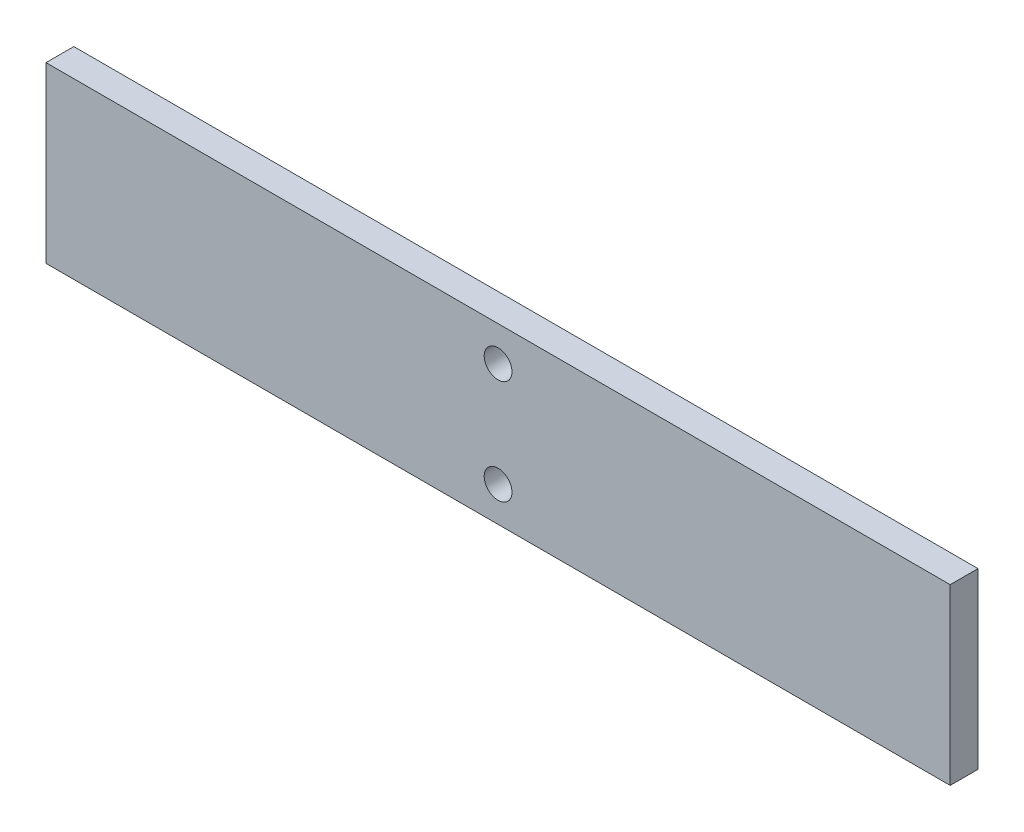
ISO-10303-21;
HEADER;
FILE_DESCRIPTION(('STEP AP214'),'2;1');
FILE_NAME('part.step','',(''),(''),'','','');
FILE_SCHEMA(('AUTOMOTIVE_DESIGN { 1 0 10303 214 1 1 1 1 }'));
ENDSEC;
DATA;
#1=APPLICATION_CONTEXT('core data for automotive mechanical design processes');
#2=APPLICATION_PROTOCOL_DEFINITION('international standard','automotive_design',2000,#1);
#3=PRODUCT_CONTEXT('',#1,'mechanical');
#4=PRODUCT('Part','Part','',(#3));
#5=PRODUCT_RELATED_PRODUCT_CATEGORY('part','',(#4));
#6=PRODUCT_DEFINITION_FORMATION('','',#4);
#7=PRODUCT_DEFINITION_CONTEXT('part definition',#1,'design');
#8=PRODUCT_DEFINITION('design','',#6,#7);
#9=PRODUCT_DEFINITION_SHAPE('','',#8);
#10=(LENGTH_UNIT() NAMED_UNIT(*) SI_UNIT(.MILLI.,.METRE.));
#11=(NAMED_UNIT(*) PLANE_ANGLE_UNIT() SI_UNIT($,.RADIAN.));
#12=(NAMED_UNIT(*) SI_UNIT($,.STERADIAN.) SOLID_ANGLE_UNIT());
#13=UNCERTAINTY_MEASURE_WITH_UNIT(LENGTH_MEASURE(1.E-05),#10,'distance_accuracy_value','');
#14=(GEOMETRIC_REPRESENTATION_CONTEXT(3) GLOBAL_UNCERTAINTY_ASSIGNED_CONTEXT((#13)) GLOBAL_UNIT_ASSIGNED_CONTEXT((#10,
#11,#12)) REPRESENTATION_CONTEXT('',''));
#15=CARTESIAN_POINT('',(0.,0.,0.));
#16=DIRECTION('',(0.,0.,1.));
#17=DIRECTION('',(1.,0.,0.));
#18=AXIS2_PLACEMENT_3D('',#15,#16,#17);
#19=CARTESIAN_POINT('',(0.,10.,1.6));
#20=DIRECTION('',(1.,0.,0.));
#21=DIRECTION('',(0.,1.,0.));
#22=AXIS2_PLACEMENT_3D('',#19,#20,#21);
#23=PLANE('',#22);
#24=DIRECTION('',(0.,-1.,0.));
#25=VECTOR('',#24,1.);
#26=CARTESIAN_POINT('',(0.,10.,0.));
#27=LINE('',#26,#25);
#28=CARTESIAN_POINT('',(0.,10.,0.));
#29=VERTEX_POINT('',#28);
#30=CARTESIAN_POINT('',(0.,0.,0.));
#31=VERTEX_POINT('',#30);
#32=EDGE_CURVE('E105',#29,#31,#27,.T.);
#33=ORIENTED_EDGE('',*,*,#32,.T.);
#34=DIRECTION('',(0.,0.,-1.));
#35=VECTOR('',#34,1.);
#36=CARTESIAN_POINT('',(0.,0.,1.6));
#37=LINE('',#36,#35);
#38=CARTESIAN_POINT('',(0.,0.,1.6));
#39=VERTEX_POINT('',#38);
#40=EDGE_CURVE('E11',#39,#31,#37,.T.);
#41=ORIENTED_EDGE('',*,*,#40,.F.);
#42=DIRECTION('',(0.,-1.,0.));
#43=VECTOR('',#42,1.);
#44=CARTESIAN_POINT('',(0.,10.,1.6));
#45=LINE('',#44,#43);
#46=CARTESIAN_POINT('',(0.,10.,1.6));
#47=VERTEX_POINT('',#46);
#48=EDGE_CURVE('E89',#47,#39,#45,.T.);
#49=ORIENTED_EDGE('',*,*,#48,.F.);
#50=DIRECTION('',(0.,0.,-1.));
#51=VECTOR('',#50,1.);
#52=CARTESIAN_POINT('',(0.,10.,1.6));
#53=LINE('',#52,#51);
#54=EDGE_CURVE('E98',#47,#29,#53,.T.);
#55=ORIENTED_EDGE('',*,*,#54,.T.);
#56=EDGE_LOOP('',(#33,#41,#49,#55));
#57=FACE_BOUND('',#56,.T.);
#58=ADVANCED_FACE('F39',(#57),#23,.F.);
#59=CARTESIAN_POINT('',(0.,0.,1.6));
#60=DIRECTION('',(0.,1.,0.));
#61=DIRECTION('',(0.,0.,1.));
#62=AXIS2_PLACEMENT_3D('',#59,#60,#61);
#63=PLANE('',#62);
#64=DIRECTION('',(1.,0.,0.));
#65=VECTOR('',#64,1.);
#66=CARTESIAN_POINT('',(0.,0.,0.));
#67=LINE('',#66,#65);
#68=CARTESIAN_POINT('',(52.,0.,0.));
#69=VERTEX_POINT('',#68);
#70=EDGE_CURVE('E94',#31,#69,#67,.T.);
#71=ORIENTED_EDGE('',*,*,#70,.T.);
#72=DIRECTION('',(0.,0.,-1.));
#73=VECTOR('',#72,1.);
#74=CARTESIAN_POINT('',(52.,0.,1.6));
#75=LINE('',#74,#73);
#76=CARTESIAN_POINT('',(52.,0.,1.6));
#77=VERTEX_POINT('',#76);
#78=EDGE_CURVE('E50',#77,#69,#75,.T.);
#79=ORIENTED_EDGE('',*,*,#78,.F.);
#80=DIRECTION('',(1.,0.,0.));
#81=VECTOR('',#80,1.);
#82=CARTESIAN_POINT('',(0.,0.,1.6));
#83=LINE('',#82,#81);
#84=EDGE_CURVE('E83',#39,#77,#83,.T.);
#85=ORIENTED_EDGE('',*,*,#84,.F.);
#86=ORIENTED_EDGE('',*,*,#40,.T.);
#87=EDGE_LOOP('',(#71,#79,#85,#86));
#88=FACE_BOUND('',#87,.T.);
#89=ADVANCED_FACE('F91',(#88),#63,.F.);
#90=CARTESIAN_POINT('',(52.,10.,1.6));
#91=DIRECTION('',(-1.,0.,0.));
#92=DIRECTION('',(0.,0.,1.));
#93=AXIS2_PLACEMENT_3D('',#90,#91,#92);
#94=PLANE('',#93);
#95=DIRECTION('',(0.,1.,0.));
#96=VECTOR('',#95,1.);
#97=CARTESIAN_POINT('',(52.,10.,0.));
#98=LINE('',#97,#96);
#99=CARTESIAN_POINT('',(52.,10.,0.));
#100=VERTEX_POINT('',#99);
#101=EDGE_CURVE('E75',#69,#100,#98,.T.);
#102=ORIENTED_EDGE('',*,*,#101,.T.);
#103=DIRECTION('',(0.,0.,-1.));
#104=VECTOR('',#103,1.);
#105=CARTESIAN_POINT('',(52.,10.,1.6));
#106=LINE('',#105,#104);
#107=CARTESIAN_POINT('',(52.,10.,1.6));
#108=VERTEX_POINT('',#107);
#109=EDGE_CURVE('E92',#108,#100,#106,.T.);
#110=ORIENTED_EDGE('',*,*,#109,.F.);
#111=DIRECTION('',(0.,1.,0.));
#112=VECTOR('',#111,1.);
#113=CARTESIAN_POINT('',(52.,10.,1.6));
#114=LINE('',#113,#112);
#115=EDGE_CURVE('E86',#77,#108,#114,.T.);
#116=ORIENTED_EDGE('',*,*,#115,.F.);
#117=ORIENTED_EDGE('',*,*,#78,.T.);
#118=EDGE_LOOP('',(#102,#110,#116,#117));
#119=FACE_BOUND('',#118,.T.);
#120=ADVANCED_FACE('F96',(#119),#94,.F.);
#121=CARTESIAN_POINT('',(0.,10.,1.6));
#122=DIRECTION('',(0.,-1.,0.));
#123=DIRECTION('',(0.,0.,-1.));
#124=AXIS2_PLACEMENT_3D('',#121,#122,#123);
#125=PLANE('',#124);
#126=DIRECTION('',(-1.,0.,0.));
#127=VECTOR('',#126,1.);
#128=CARTESIAN_POINT('',(0.,10.,0.));
#129=LINE('',#128,#127);
#130=EDGE_CURVE('E79',#100,#29,#129,.T.);
#131=ORIENTED_EDGE('',*,*,#130,.T.);
#132=ORIENTED_EDGE('',*,*,#54,.F.);
#133=DIRECTION('',(-1.,0.,0.));
#134=VECTOR('',#133,1.);
#135=CARTESIAN_POINT('',(0.,10.,1.6));
#136=LINE('',#135,#134);
#137=EDGE_CURVE('E54',#108,#47,#136,.T.);
#138=ORIENTED_EDGE('',*,*,#137,.F.);
#139=ORIENTED_EDGE('',*,*,#109,.T.);
#140=EDGE_LOOP('',(#131,#132,#138,#139));
#141=FACE_BOUND('',#140,.T.);
#142=ADVANCED_FACE('F109',(#141),#125,.F.);
#143=CARTESIAN_POINT('',(0.,0.,1.6));
#144=DIRECTION('',(0.,0.,1.));
#145=DIRECTION('',(1.,0.,0.));
#146=AXIS2_PLACEMENT_3D('',#143,#144,#145);
#147=PLANE('',#146);
#148=CARTESIAN_POINT('',(26.,2.,1.6));
#149=DIRECTION('',(0.,0.,1.));
#150=DIRECTION('',(1.,0.,0.));
#151=AXIS2_PLACEMENT_3D('',#148,#149,#150);
#152=CIRCLE('',#151,0.799999999999999);
#153=CARTESIAN_POINT('',(26.8,2.,1.6));
#154=VERTEX_POINT('',#153);
#155=EDGE_CURVE('E104',#154,#154,#152,.T.);
#156=ORIENTED_EDGE('',*,*,#155,.F.);
#157=EDGE_LOOP('',(#156));
#158=FACE_BOUND('',#157,.T.);
#159=CARTESIAN_POINT('',(26.,8.,1.6));
#160=DIRECTION('',(0.,0.,1.));
#161=DIRECTION('',(1.,0.,0.));
#162=AXIS2_PLACEMENT_3D('',#159,#160,#161);
#163=CIRCLE('',#162,0.799999999999999);
#164=CARTESIAN_POINT('',(26.8,8.,1.6));
#165=VERTEX_POINT('',#164);
#166=EDGE_CURVE('E117',#165,#165,#163,.T.);
#167=ORIENTED_EDGE('',*,*,#166,.F.);
#168=EDGE_LOOP('',(#167));
#169=FACE_BOUND('',#168,.T.);
#170=ORIENTED_EDGE('',*,*,#48,.T.);
#171=ORIENTED_EDGE('',*,*,#84,.T.);
#172=ORIENTED_EDGE('',*,*,#115,.T.);
#173=ORIENTED_EDGE('',*,*,#137,.T.);
#174=EDGE_LOOP('',(#170,#171,#172,#173));
#175=FACE_BOUND('',#174,.T.);
#176=ADVANCED_FACE('F88',(#158,#169,#175),#147,.T.);
#177=CARTESIAN_POINT('',(0.,0.,0.));
#178=DIRECTION('',(0.,0.,1.));
#179=DIRECTION('',(1.,0.,0.));
#180=AXIS2_PLACEMENT_3D('',#177,#178,#179);
#181=PLANE('',#180);
#182=CARTESIAN_POINT('',(26.,2.,0.));
#183=DIRECTION('',(0.,0.,1.));
#184=DIRECTION('',(1.,0.,0.));
#185=AXIS2_PLACEMENT_3D('',#182,#183,#184);
#186=CIRCLE('',#185,0.799999999999999);
#187=CARTESIAN_POINT('',(26.8,2.,0.));
#188=VERTEX_POINT('',#187);
#189=EDGE_CURVE('E124',#188,#188,#186,.T.);
#190=ORIENTED_EDGE('',*,*,#189,.T.);
#191=EDGE_LOOP('',(#190));
#192=FACE_BOUND('',#191,.T.);
#193=CARTESIAN_POINT('',(26.,8.,0.));
#194=DIRECTION('',(0.,0.,1.));
#195=DIRECTION('',(1.,0.,0.));
#196=AXIS2_PLACEMENT_3D('',#193,#194,#195);
#197=CIRCLE('',#196,0.799999999999999);
#198=CARTESIAN_POINT('',(26.8,8.,0.));
#199=VERTEX_POINT('',#198);
#200=EDGE_CURVE('E116',#199,#199,#197,.T.);
#201=ORIENTED_EDGE('',*,*,#200,.T.);
#202=EDGE_LOOP('',(#201));
#203=FACE_BOUND('',#202,.T.);
#204=ORIENTED_EDGE('',*,*,#32,.F.);
#205=ORIENTED_EDGE('',*,*,#130,.F.);
#206=ORIENTED_EDGE('',*,*,#101,.F.);
#207=ORIENTED_EDGE('',*,*,#70,.F.);
#208=EDGE_LOOP('',(#204,#205,#206,#207));
#209=FACE_BOUND('',#208,.T.);
#210=ADVANCED_FACE('F114',(#192,#203,#209),#181,.F.);
#211=CARTESIAN_POINT('',(26.,8.,1.6));
#212=DIRECTION('',(0.,0.,-1.));
#213=DIRECTION('',(-1.,0.,0.));
#214=AXIS2_PLACEMENT_3D('',#211,#212,#213);
#215=CYLINDRICAL_SURFACE('',#214,0.799999999999999);
#216=ORIENTED_EDGE('',*,*,#166,.T.);
#217=EDGE_LOOP('',(#216));
#218=FACE_BOUND('',#217,.T.);
#219=ORIENTED_EDGE('',*,*,#200,.F.);
#220=EDGE_LOOP('',(#219));
#221=FACE_BOUND('',#220,.T.);
#222=ADVANCED_FACE('F137',(#218,#221),#215,.F.);
#223=CARTESIAN_POINT('',(26.,2.,1.6));
#224=DIRECTION('',(0.,0.,-1.));
#225=DIRECTION('',(-1.,0.,0.));
#226=AXIS2_PLACEMENT_3D('',#223,#224,#225);
#227=CYLINDRICAL_SURFACE('',#226,0.799999999999999);
#228=ORIENTED_EDGE('',*,*,#155,.T.);
#229=EDGE_LOOP('',(#228));
#230=FACE_BOUND('',#229,.T.);
#231=ORIENTED_EDGE('',*,*,#189,.F.);
#232=EDGE_LOOP('',(#231));
#233=FACE_BOUND('',#232,.T.);
#234=ADVANCED_FACE('F126',(#230,#233),#227,.F.);
#235=CLOSED_SHELL('',(#58,#89,#120,#142,#176,#210,#222,#234));
#236=MANIFOLD_SOLID_BREP('B2',#235);
#237=ADVANCED_BREP_SHAPE_REPRESENTATION('',(#18,#236),#14);
#238=SHAPE_DEFINITION_REPRESENTATION(#9,#237);
ENDSEC;
END-ISO-10303-21;
